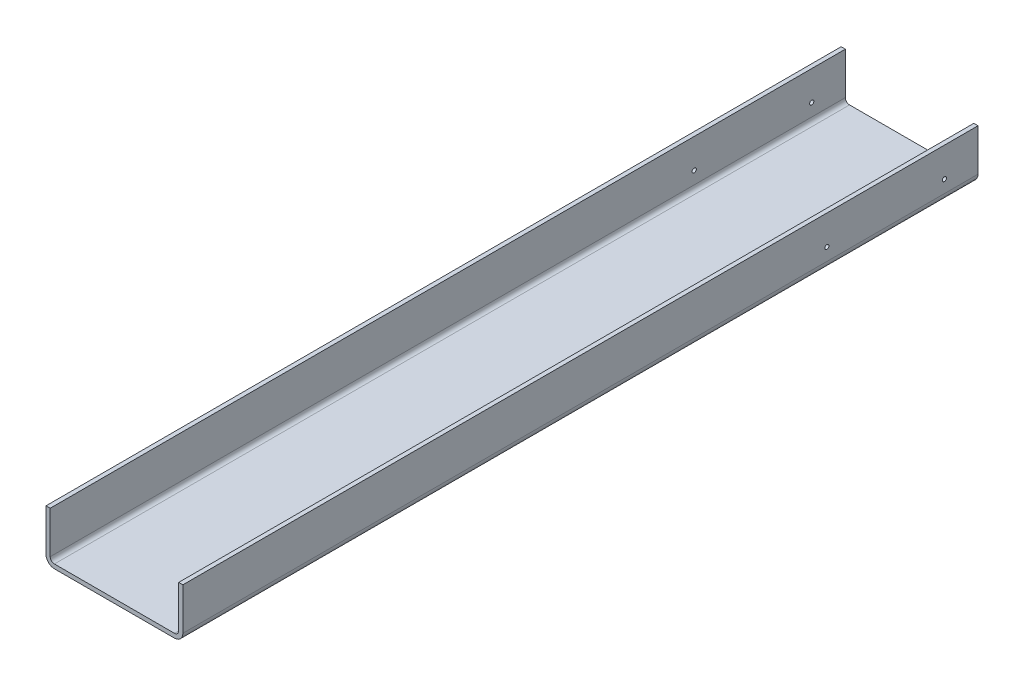
ISO-10303-21;
HEADER;
FILE_DESCRIPTION(('STEP AP214'),'2;1');
FILE_NAME('part.step','',(''),(''),'','','');
FILE_SCHEMA(('AUTOMOTIVE_DESIGN { 1 0 10303 214 1 1 1 1 }'));
ENDSEC;
DATA;
#1=APPLICATION_CONTEXT('core data for automotive mechanical design processes');
#2=APPLICATION_PROTOCOL_DEFINITION('international standard','automotive_design',2000,#1);
#3=PRODUCT_CONTEXT('',#1,'mechanical');
#4=PRODUCT('Part','Part','',(#3));
#5=PRODUCT_RELATED_PRODUCT_CATEGORY('part','',(#4));
#6=PRODUCT_DEFINITION_FORMATION('','',#4);
#7=PRODUCT_DEFINITION_CONTEXT('part definition',#1,'design');
#8=PRODUCT_DEFINITION('design','',#6,#7);
#9=PRODUCT_DEFINITION_SHAPE('','',#8);
#10=(LENGTH_UNIT() NAMED_UNIT(*) SI_UNIT(.MILLI.,.METRE.));
#11=(NAMED_UNIT(*) PLANE_ANGLE_UNIT() SI_UNIT($,.RADIAN.));
#12=(NAMED_UNIT(*) SI_UNIT($,.STERADIAN.) SOLID_ANGLE_UNIT());
#13=UNCERTAINTY_MEASURE_WITH_UNIT(LENGTH_MEASURE(1.E-05),#10,'distance_accuracy_value','');
#14=(GEOMETRIC_REPRESENTATION_CONTEXT(3) GLOBAL_UNCERTAINTY_ASSIGNED_CONTEXT((#13)) GLOBAL_UNIT_ASSIGNED_CONTEXT((#10,
#11,#12)) REPRESENTATION_CONTEXT('',''));
#15=CARTESIAN_POINT('',(0.,0.,0.));
#16=DIRECTION('',(0.,0.,1.));
#17=DIRECTION('',(1.,0.,0.));
#18=AXIS2_PLACEMENT_3D('',#15,#16,#17);
#19=CARTESIAN_POINT('',(76.5,60.,473.5));
#20=DIRECTION('',(0.,-1.,0.));
#21=DIRECTION('',(0.,0.,-1.));
#22=AXIS2_PLACEMENT_3D('',#19,#20,#21);
#23=PLANE('',#22);
#24=DIRECTION('',(-1.,0.,0.));
#25=VECTOR('',#24,1.);
#26=CARTESIAN_POINT('',(76.5,60.,-473.5));
#27=LINE('',#26,#25);
#28=CARTESIAN_POINT('',(81.5,60.,-473.5));
#29=VERTEX_POINT('',#28);
#30=CARTESIAN_POINT('',(76.5,60.,-473.5));
#31=VERTEX_POINT('',#30);
#32=EDGE_CURVE('E165',#29,#31,#27,.T.);
#33=ORIENTED_EDGE('',*,*,#32,.T.);
#34=DIRECTION('',(0.,0.,-1.));
#35=VECTOR('',#34,1.);
#36=CARTESIAN_POINT('',(76.5,60.,473.5));
#37=LINE('',#36,#35);
#38=CARTESIAN_POINT('',(76.5,60.,473.5));
#39=VERTEX_POINT('',#38);
#40=EDGE_CURVE('E11',#39,#31,#37,.T.);
#41=ORIENTED_EDGE('',*,*,#40,.F.);
#42=DIRECTION('',(-1.,0.,0.));
#43=VECTOR('',#42,1.);
#44=CARTESIAN_POINT('',(76.5,60.,473.5));
#45=LINE('',#44,#43);
#46=CARTESIAN_POINT('',(81.5,60.,473.5));
#47=VERTEX_POINT('',#46);
#48=EDGE_CURVE('E188',#47,#39,#45,.T.);
#49=ORIENTED_EDGE('',*,*,#48,.F.);
#50=DIRECTION('',(0.,0.,-1.));
#51=VECTOR('',#50,1.);
#52=CARTESIAN_POINT('',(81.5,60.,473.5));
#53=LINE('',#52,#51);
#54=EDGE_CURVE('E161',#47,#29,#53,.T.);
#55=ORIENTED_EDGE('',*,*,#54,.T.);
#56=EDGE_LOOP('',(#33,#41,#49,#55));
#57=FACE_BOUND('',#56,.T.);
#58=ADVANCED_FACE('F45',(#57),#23,.F.);
#59=CARTESIAN_POINT('',(76.5,9.99999999999998,473.5));
#60=DIRECTION('',(1.,0.,0.));
#61=DIRECTION('',(0.,0.,-1.));
#62=AXIS2_PLACEMENT_3D('',#59,#60,#61);
#63=PLANE('',#62);
#64=CARTESIAN_POINT('',(76.5,24.9114999999389,-433.5));
#65=DIRECTION('',(1.,0.,0.));
#66=DIRECTION('',(0.,0.,-1.));
#67=AXIS2_PLACEMENT_3D('',#64,#65,#66);
#68=CIRCLE('',#67,2.50000000000002);
#69=CARTESIAN_POINT('',(76.5,24.9114999999389,-436.));
#70=VERTEX_POINT('',#69);
#71=EDGE_CURVE('E169',#70,#70,#68,.T.);
#72=ORIENTED_EDGE('',*,*,#71,.T.);
#73=EDGE_LOOP('',(#72));
#74=FACE_BOUND('',#73,.T.);
#75=CARTESIAN_POINT('',(76.5,24.9114999999389,-293.5));
#76=DIRECTION('',(1.,0.,0.));
#77=DIRECTION('',(0.,0.,-1.));
#78=AXIS2_PLACEMENT_3D('',#75,#76,#77);
#79=CIRCLE('',#78,2.49999999999991);
#80=CARTESIAN_POINT('',(76.5,24.9114999999389,-296.));
#81=VERTEX_POINT('',#80);
#82=EDGE_CURVE('E445',#81,#81,#79,.T.);
#83=ORIENTED_EDGE('',*,*,#82,.T.);
#84=EDGE_LOOP('',(#83));
#85=FACE_BOUND('',#84,.T.);
#86=DIRECTION('',(0.,-1.,0.));
#87=VECTOR('',#86,1.);
#88=CARTESIAN_POINT('',(76.5,9.99999999999998,-473.5));
#89=LINE('',#88,#87);
#90=CARTESIAN_POINT('',(76.5,9.99999999999998,-473.5));
#91=VERTEX_POINT('',#90);
#92=EDGE_CURVE('E168',#31,#91,#89,.T.);
#93=ORIENTED_EDGE('',*,*,#92,.T.);
#94=DIRECTION('',(0.,0.,-1.));
#95=VECTOR('',#94,1.);
#96=CARTESIAN_POINT('',(76.5,9.99999999999998,473.5));
#97=LINE('',#96,#95);
#98=CARTESIAN_POINT('',(76.5,9.99999999999998,473.5));
#99=VERTEX_POINT('',#98);
#100=EDGE_CURVE('E53',#99,#91,#97,.T.);
#101=ORIENTED_EDGE('',*,*,#100,.F.);
#102=DIRECTION('',(0.,-1.,0.));
#103=VECTOR('',#102,1.);
#104=CARTESIAN_POINT('',(76.5,9.99999999999998,473.5));
#105=LINE('',#104,#103);
#106=EDGE_CURVE('E116',#39,#99,#105,.T.);
#107=ORIENTED_EDGE('',*,*,#106,.F.);
#108=ORIENTED_EDGE('',*,*,#40,.T.);
#109=EDGE_LOOP('',(#93,#101,#107,#108));
#110=FACE_BOUND('',#109,.T.);
#111=ADVANCED_FACE('F271',(#74,#85,#110),#63,.F.);
#112=CARTESIAN_POINT('',(71.5,9.99999999999998,473.5));
#113=DIRECTION('',(0.,0.,-1.));
#114=DIRECTION('',(-1.,0.,0.));
#115=AXIS2_PLACEMENT_3D('',#112,#113,#114);
#116=CYLINDRICAL_SURFACE('',#115,5.);
#117=CARTESIAN_POINT('',(71.5,9.99999999999998,-473.5));
#118=DIRECTION('',(0.,0.,-1.));
#119=DIRECTION('',(-1.,0.,0.));
#120=AXIS2_PLACEMENT_3D('',#117,#118,#119);
#121=CIRCLE('',#120,5.);
#122=CARTESIAN_POINT('',(71.5,4.99999999999998,-473.5));
#123=VERTEX_POINT('',#122);
#124=EDGE_CURVE('E171',#91,#123,#121,.T.);
#125=ORIENTED_EDGE('',*,*,#124,.T.);
#126=DIRECTION('',(0.,0.,-1.));
#127=VECTOR('',#126,1.);
#128=CARTESIAN_POINT('',(71.5,4.99999999999998,473.5));
#129=LINE('',#128,#127);
#130=CARTESIAN_POINT('',(71.5,4.99999999999998,473.5));
#131=VERTEX_POINT('',#130);
#132=EDGE_CURVE('E207',#131,#123,#129,.T.);
#133=ORIENTED_EDGE('',*,*,#132,.F.);
#134=CARTESIAN_POINT('',(71.5,9.99999999999998,473.5));
#135=DIRECTION('',(0.,0.,-1.));
#136=DIRECTION('',(-1.,0.,0.));
#137=AXIS2_PLACEMENT_3D('',#134,#135,#136);
#138=CIRCLE('',#137,5.);
#139=EDGE_CURVE('E215',#99,#131,#138,.T.);
#140=ORIENTED_EDGE('',*,*,#139,.F.);
#141=ORIENTED_EDGE('',*,*,#100,.T.);
#142=EDGE_LOOP('',(#125,#133,#140,#141));
#143=FACE_BOUND('',#142,.T.);
#144=ADVANCED_FACE('F213',(#143),#116,.F.);
#145=CARTESIAN_POINT('',(71.5,4.99999999999998,473.5));
#146=DIRECTION('',(0.,-1.,0.));
#147=DIRECTION('',(0.,0.,-1.));
#148=AXIS2_PLACEMENT_3D('',#145,#146,#147);
#149=PLANE('',#148);
#150=DIRECTION('',(-1.,0.,0.));
#151=VECTOR('',#150,1.);
#152=CARTESIAN_POINT('',(71.5,4.99999999999998,-473.5));
#153=LINE('',#152,#151);
#154=CARTESIAN_POINT('',(-71.5,4.99999999999998,-473.5));
#155=VERTEX_POINT('',#154);
#156=EDGE_CURVE('E173',#123,#155,#153,.T.);
#157=ORIENTED_EDGE('',*,*,#156,.T.);
#158=DIRECTION('',(0.,0.,-1.));
#159=VECTOR('',#158,1.);
#160=CARTESIAN_POINT('',(-71.5,4.99999999999998,473.5));
#161=LINE('',#160,#159);
#162=CARTESIAN_POINT('',(-71.5,4.99999999999998,473.5));
#163=VERTEX_POINT('',#162);
#164=EDGE_CURVE('E204',#163,#155,#161,.T.);
#165=ORIENTED_EDGE('',*,*,#164,.F.);
#166=DIRECTION('',(-1.,0.,0.));
#167=VECTOR('',#166,1.);
#168=CARTESIAN_POINT('',(71.5,4.99999999999998,473.5));
#169=LINE('',#168,#167);
#170=EDGE_CURVE('E233',#131,#163,#169,.T.);
#171=ORIENTED_EDGE('',*,*,#170,.F.);
#172=ORIENTED_EDGE('',*,*,#132,.T.);
#173=EDGE_LOOP('',(#157,#165,#171,#172));
#174=FACE_BOUND('',#173,.T.);
#175=ADVANCED_FACE('F224',(#174),#149,.F.);
#176=CARTESIAN_POINT('',(-71.5,9.99999999999998,473.5));
#177=DIRECTION('',(0.,0.,-1.));
#178=DIRECTION('',(-1.,0.,0.));
#179=AXIS2_PLACEMENT_3D('',#176,#177,#178);
#180=CYLINDRICAL_SURFACE('',#179,5.);
#181=CARTESIAN_POINT('',(-71.5,9.99999999999998,-473.5));
#182=DIRECTION('',(0.,0.,-1.));
#183=DIRECTION('',(-1.,0.,0.));
#184=AXIS2_PLACEMENT_3D('',#181,#182,#183);
#185=CIRCLE('',#184,5.);
#186=CARTESIAN_POINT('',(-76.5,9.99999999999998,-473.5));
#187=VERTEX_POINT('',#186);
#188=EDGE_CURVE('E175',#155,#187,#185,.T.);
#189=ORIENTED_EDGE('',*,*,#188,.T.);
#190=DIRECTION('',(0.,0.,-1.));
#191=VECTOR('',#190,1.);
#192=CARTESIAN_POINT('',(-76.5,9.99999999999998,473.5));
#193=LINE('',#192,#191);
#194=CARTESIAN_POINT('',(-76.5,9.99999999999998,473.5));
#195=VERTEX_POINT('',#194);
#196=EDGE_CURVE('E201',#195,#187,#193,.T.);
#197=ORIENTED_EDGE('',*,*,#196,.F.);
#198=CARTESIAN_POINT('',(-71.5,9.99999999999998,473.5));
#199=DIRECTION('',(0.,0.,-1.));
#200=DIRECTION('',(-1.,0.,0.));
#201=AXIS2_PLACEMENT_3D('',#198,#199,#200);
#202=CIRCLE('',#201,5.);
#203=EDGE_CURVE('E230',#163,#195,#202,.T.);
#204=ORIENTED_EDGE('',*,*,#203,.F.);
#205=ORIENTED_EDGE('',*,*,#164,.T.);
#206=EDGE_LOOP('',(#189,#197,#204,#205));
#207=FACE_BOUND('',#206,.T.);
#208=ADVANCED_FACE('F228',(#207),#180,.F.);
#209=CARTESIAN_POINT('',(-76.5,9.99999999999998,473.5));
#210=DIRECTION('',(-1.,0.,0.));
#211=DIRECTION('',(0.,0.,1.));
#212=AXIS2_PLACEMENT_3D('',#209,#210,#211);
#213=PLANE('',#212);
#214=CARTESIAN_POINT('',(-76.5,24.9114999999389,-433.5));
#215=DIRECTION('',(-1.,0.,0.));
#216=DIRECTION('',(0.,0.,1.));
#217=AXIS2_PLACEMENT_3D('',#214,#215,#216);
#218=CIRCLE('',#217,2.50000000000002);
#219=CARTESIAN_POINT('',(-76.5,24.9114999999389,-431.));
#220=VERTEX_POINT('',#219);
#221=EDGE_CURVE('E450',#220,#220,#218,.T.);
#222=ORIENTED_EDGE('',*,*,#221,.T.);
#223=EDGE_LOOP('',(#222));
#224=FACE_BOUND('',#223,.T.);
#225=CARTESIAN_POINT('',(-76.5,24.9114999999389,-293.5));
#226=DIRECTION('',(-1.,0.,0.));
#227=DIRECTION('',(0.,0.,1.));
#228=AXIS2_PLACEMENT_3D('',#225,#226,#227);
#229=CIRCLE('',#228,2.49999999999991);
#230=CARTESIAN_POINT('',(-76.5,24.9114999999389,-291.));
#231=VERTEX_POINT('',#230);
#232=EDGE_CURVE('E447',#231,#231,#229,.T.);
#233=ORIENTED_EDGE('',*,*,#232,.T.);
#234=EDGE_LOOP('',(#233));
#235=FACE_BOUND('',#234,.T.);
#236=DIRECTION('',(0.,1.,0.));
#237=VECTOR('',#236,1.);
#238=CARTESIAN_POINT('',(-76.5,9.99999999999998,-473.5));
#239=LINE('',#238,#237);
#240=CARTESIAN_POINT('',(-76.5,60.,-473.5));
#241=VERTEX_POINT('',#240);
#242=EDGE_CURVE('E177',#187,#241,#239,.T.);
#243=ORIENTED_EDGE('',*,*,#242,.T.);
#244=DIRECTION('',(0.,0.,-1.));
#245=VECTOR('',#244,1.);
#246=CARTESIAN_POINT('',(-76.5,60.,473.5));
#247=LINE('',#246,#245);
#248=CARTESIAN_POINT('',(-76.5,60.,473.5));
#249=VERTEX_POINT('',#248);
#250=EDGE_CURVE('E198',#249,#241,#247,.T.);
#251=ORIENTED_EDGE('',*,*,#250,.F.);
#252=DIRECTION('',(0.,1.,0.));
#253=VECTOR('',#252,1.);
#254=CARTESIAN_POINT('',(-76.5,9.99999999999998,473.5));
#255=LINE('',#254,#253);
#256=EDGE_CURVE('E232',#195,#249,#255,.T.);
#257=ORIENTED_EDGE('',*,*,#256,.F.);
#258=ORIENTED_EDGE('',*,*,#196,.T.);
#259=EDGE_LOOP('',(#243,#251,#257,#258));
#260=FACE_BOUND('',#259,.T.);
#261=ADVANCED_FACE('F288',(#224,#235,#260),#213,.F.);
#262=CARTESIAN_POINT('',(-81.5,60.,473.5));
#263=DIRECTION('',(0.,-1.,0.));
#264=DIRECTION('',(0.,0.,-1.));
#265=AXIS2_PLACEMENT_3D('',#262,#263,#264);
#266=PLANE('',#265);
#267=DIRECTION('',(-1.,0.,0.));
#268=VECTOR('',#267,1.);
#269=CARTESIAN_POINT('',(-81.5,60.,-473.5));
#270=LINE('',#269,#268);
#271=CARTESIAN_POINT('',(-81.5,60.,-473.5));
#272=VERTEX_POINT('',#271);
#273=EDGE_CURVE('E179',#241,#272,#270,.T.);
#274=ORIENTED_EDGE('',*,*,#273,.T.);
#275=DIRECTION('',(0.,0.,-1.));
#276=VECTOR('',#275,1.);
#277=CARTESIAN_POINT('',(-81.5,60.,473.5));
#278=LINE('',#277,#276);
#279=CARTESIAN_POINT('',(-81.5,60.,473.5));
#280=VERTEX_POINT('',#279);
#281=EDGE_CURVE('E195',#280,#272,#278,.T.);
#282=ORIENTED_EDGE('',*,*,#281,.F.);
#283=DIRECTION('',(-1.,0.,0.));
#284=VECTOR('',#283,1.);
#285=CARTESIAN_POINT('',(-81.5,60.,473.5));
#286=LINE('',#285,#284);
#287=EDGE_CURVE('E235',#249,#280,#286,.T.);
#288=ORIENTED_EDGE('',*,*,#287,.F.);
#289=ORIENTED_EDGE('',*,*,#250,.T.);
#290=EDGE_LOOP('',(#274,#282,#288,#289));
#291=FACE_BOUND('',#290,.T.);
#292=ADVANCED_FACE('F291',(#291),#266,.F.);
#293=CARTESIAN_POINT('',(-81.5,9.99999999999998,473.5));
#294=DIRECTION('',(1.,0.,0.));
#295=DIRECTION('',(0.,0.,-1.));
#296=AXIS2_PLACEMENT_3D('',#293,#294,#295);
#297=PLANE('',#296);
#298=CARTESIAN_POINT('',(-81.5,24.9114999999389,-433.5));
#299=DIRECTION('',(1.,0.,0.));
#300=DIRECTION('',(0.,0.,-1.));
#301=AXIS2_PLACEMENT_3D('',#298,#299,#300);
#302=CIRCLE('',#301,2.50000000000002);
#303=CARTESIAN_POINT('',(-81.5,24.9114999999389,-436.));
#304=VERTEX_POINT('',#303);
#305=EDGE_CURVE('E446',#304,#304,#302,.T.);
#306=ORIENTED_EDGE('',*,*,#305,.T.);
#307=EDGE_LOOP('',(#306));
#308=FACE_BOUND('',#307,.T.);
#309=CARTESIAN_POINT('',(-81.5,24.9114999999389,-293.5));
#310=DIRECTION('',(1.,0.,0.));
#311=DIRECTION('',(0.,0.,-1.));
#312=AXIS2_PLACEMENT_3D('',#309,#310,#311);
#313=CIRCLE('',#312,2.49999999999991);
#314=CARTESIAN_POINT('',(-81.5,24.9114999999389,-296.));
#315=VERTEX_POINT('',#314);
#316=EDGE_CURVE('E453',#315,#315,#313,.T.);
#317=ORIENTED_EDGE('',*,*,#316,.T.);
#318=EDGE_LOOP('',(#317));
#319=FACE_BOUND('',#318,.T.);
#320=DIRECTION('',(0.,-1.,0.));
#321=VECTOR('',#320,1.);
#322=CARTESIAN_POINT('',(-81.5,9.99999999999998,-473.5));
#323=LINE('',#322,#321);
#324=CARTESIAN_POINT('',(-81.5,9.99999999999998,-473.5));
#325=VERTEX_POINT('',#324);
#326=EDGE_CURVE('E181',#272,#325,#323,.T.);
#327=ORIENTED_EDGE('',*,*,#326,.T.);
#328=DIRECTION('',(0.,0.,-1.));
#329=VECTOR('',#328,1.);
#330=CARTESIAN_POINT('',(-81.5,9.99999999999998,473.5));
#331=LINE('',#330,#329);
#332=CARTESIAN_POINT('',(-81.5,9.99999999999998,473.5));
#333=VERTEX_POINT('',#332);
#334=EDGE_CURVE('E192',#333,#325,#331,.T.);
#335=ORIENTED_EDGE('',*,*,#334,.F.);
#336=DIRECTION('',(0.,-1.,0.));
#337=VECTOR('',#336,1.);
#338=CARTESIAN_POINT('',(-81.5,9.99999999999998,473.5));
#339=LINE('',#338,#337);
#340=EDGE_CURVE('E241',#280,#333,#339,.T.);
#341=ORIENTED_EDGE('',*,*,#340,.F.);
#342=ORIENTED_EDGE('',*,*,#281,.T.);
#343=EDGE_LOOP('',(#327,#335,#341,#342));
#344=FACE_BOUND('',#343,.T.);
#345=ADVANCED_FACE('F247',(#308,#319,#344),#297,.F.);
#346=CARTESIAN_POINT('',(-71.5,9.99999999999998,473.5));
#347=DIRECTION('',(0.,0.,-1.));
#348=DIRECTION('',(-1.,0.,0.));
#349=AXIS2_PLACEMENT_3D('',#346,#347,#348);
#350=CYLINDRICAL_SURFACE('',#349,9.99999999999999);
#351=CARTESIAN_POINT('',(-71.5,9.99999999999998,-473.5));
#352=DIRECTION('',(0.,0.,1.));
#353=DIRECTION('',(-1.,0.,0.));
#354=AXIS2_PLACEMENT_3D('',#351,#352,#353);
#355=CIRCLE('',#354,9.99999999999999);
#356=CARTESIAN_POINT('',(-71.5,0.,-473.5));
#357=VERTEX_POINT('',#356);
#358=EDGE_CURVE('E183',#325,#357,#355,.T.);
#359=ORIENTED_EDGE('',*,*,#358,.T.);
#360=DIRECTION('',(0.,0.,-1.));
#361=VECTOR('',#360,1.);
#362=CARTESIAN_POINT('',(-71.5,0.,473.5));
#363=LINE('',#362,#361);
#364=CARTESIAN_POINT('',(-71.5,0.,473.5));
#365=VERTEX_POINT('',#364);
#366=EDGE_CURVE('E156',#365,#357,#363,.T.);
#367=ORIENTED_EDGE('',*,*,#366,.F.);
#368=CARTESIAN_POINT('',(-71.5,9.99999999999998,473.5));
#369=DIRECTION('',(0.,0.,1.));
#370=DIRECTION('',(-1.,0.,0.));
#371=AXIS2_PLACEMENT_3D('',#368,#369,#370);
#372=CIRCLE('',#371,9.99999999999999);
#373=EDGE_CURVE('E147',#333,#365,#372,.T.);
#374=ORIENTED_EDGE('',*,*,#373,.F.);
#375=ORIENTED_EDGE('',*,*,#334,.T.);
#376=EDGE_LOOP('',(#359,#367,#374,#375));
#377=FACE_BOUND('',#376,.T.);
#378=ADVANCED_FACE('F251',(#377),#350,.T.);
#379=CARTESIAN_POINT('',(71.5,0.,473.5));
#380=DIRECTION('',(0.,1.,0.));
#381=DIRECTION('',(0.,0.,1.));
#382=AXIS2_PLACEMENT_3D('',#379,#380,#381);
#383=PLANE('',#382);
#384=DIRECTION('',(1.,0.,0.));
#385=VECTOR('',#384,1.);
#386=CARTESIAN_POINT('',(71.5,0.,-473.5));
#387=LINE('',#386,#385);
#388=CARTESIAN_POINT('',(71.5,0.,-473.5));
#389=VERTEX_POINT('',#388);
#390=EDGE_CURVE('E155',#357,#389,#387,.T.);
#391=ORIENTED_EDGE('',*,*,#390,.T.);
#392=DIRECTION('',(0.,0.,-1.));
#393=VECTOR('',#392,1.);
#394=CARTESIAN_POINT('',(71.5,0.,473.5));
#395=LINE('',#394,#393);
#396=CARTESIAN_POINT('',(71.5,0.,473.5));
#397=VERTEX_POINT('',#396);
#398=EDGE_CURVE('E152',#397,#389,#395,.T.);
#399=ORIENTED_EDGE('',*,*,#398,.F.);
#400=DIRECTION('',(1.,0.,0.));
#401=VECTOR('',#400,1.);
#402=CARTESIAN_POINT('',(71.5,0.,473.5));
#403=LINE('',#402,#401);
#404=EDGE_CURVE('E141',#365,#397,#403,.T.);
#405=ORIENTED_EDGE('',*,*,#404,.F.);
#406=ORIENTED_EDGE('',*,*,#366,.T.);
#407=EDGE_LOOP('',(#391,#399,#405,#406));
#408=FACE_BOUND('',#407,.T.);
#409=ADVANCED_FACE('F153',(#408),#383,.F.);
#410=CARTESIAN_POINT('',(71.5,9.99999999999998,473.5));
#411=DIRECTION('',(0.,0.,-1.));
#412=DIRECTION('',(-1.,0.,0.));
#413=AXIS2_PLACEMENT_3D('',#410,#411,#412);
#414=CYLINDRICAL_SURFACE('',#413,9.99999999999999);
#415=CARTESIAN_POINT('',(71.5,9.99999999999998,-473.5));
#416=DIRECTION('',(0.,0.,1.));
#417=DIRECTION('',(-1.,0.,0.));
#418=AXIS2_PLACEMENT_3D('',#415,#416,#417);
#419=CIRCLE('',#418,9.99999999999999);
#420=CARTESIAN_POINT('',(81.5,9.99999999999998,-473.5));
#421=VERTEX_POINT('',#420);
#422=EDGE_CURVE('E102',#389,#421,#419,.T.);
#423=ORIENTED_EDGE('',*,*,#422,.T.);
#424=DIRECTION('',(0.,0.,-1.));
#425=VECTOR('',#424,1.);
#426=CARTESIAN_POINT('',(81.5,9.99999999999998,473.5));
#427=LINE('',#426,#425);
#428=CARTESIAN_POINT('',(81.5,9.99999999999998,473.5));
#429=VERTEX_POINT('',#428);
#430=EDGE_CURVE('E157',#429,#421,#427,.T.);
#431=ORIENTED_EDGE('',*,*,#430,.F.);
#432=CARTESIAN_POINT('',(71.5,9.99999999999998,473.5));
#433=DIRECTION('',(0.,0.,1.));
#434=DIRECTION('',(-1.,0.,0.));
#435=AXIS2_PLACEMENT_3D('',#432,#433,#434);
#436=CIRCLE('',#435,9.99999999999999);
#437=EDGE_CURVE('E145',#397,#429,#436,.T.);
#438=ORIENTED_EDGE('',*,*,#437,.F.);
#439=ORIENTED_EDGE('',*,*,#398,.T.);
#440=EDGE_LOOP('',(#423,#431,#438,#439));
#441=FACE_BOUND('',#440,.T.);
#442=ADVANCED_FACE('F159',(#441),#414,.T.);
#443=CARTESIAN_POINT('',(81.5,9.99999999999998,473.5));
#444=DIRECTION('',(-1.,0.,0.));
#445=DIRECTION('',(0.,0.,1.));
#446=AXIS2_PLACEMENT_3D('',#443,#444,#445);
#447=PLANE('',#446);
#448=CARTESIAN_POINT('',(81.5,24.9114999999389,-433.5));
#449=DIRECTION('',(-1.,0.,0.));
#450=DIRECTION('',(0.,0.,1.));
#451=AXIS2_PLACEMENT_3D('',#448,#449,#450);
#452=CIRCLE('',#451,2.50000000000002);
#453=CARTESIAN_POINT('',(81.5,24.9114999999389,-431.));
#454=VERTEX_POINT('',#453);
#455=EDGE_CURVE('E473',#454,#454,#452,.T.);
#456=ORIENTED_EDGE('',*,*,#455,.T.);
#457=EDGE_LOOP('',(#456));
#458=FACE_BOUND('',#457,.T.);
#459=CARTESIAN_POINT('',(81.5,24.9114999999389,-293.5));
#460=DIRECTION('',(-1.,0.,0.));
#461=DIRECTION('',(0.,0.,1.));
#462=AXIS2_PLACEMENT_3D('',#459,#460,#461);
#463=CIRCLE('',#462,2.49999999999991);
#464=CARTESIAN_POINT('',(81.5,24.9114999999389,-291.));
#465=VERTEX_POINT('',#464);
#466=EDGE_CURVE('E442',#465,#465,#463,.T.);
#467=ORIENTED_EDGE('',*,*,#466,.T.);
#468=EDGE_LOOP('',(#467));
#469=FACE_BOUND('',#468,.T.);
#470=DIRECTION('',(0.,1.,0.));
#471=VECTOR('',#470,1.);
#472=CARTESIAN_POINT('',(81.5,9.99999999999998,-473.5));
#473=LINE('',#472,#471);
#474=EDGE_CURVE('E108',#421,#29,#473,.T.);
#475=ORIENTED_EDGE('',*,*,#474,.T.);
#476=ORIENTED_EDGE('',*,*,#54,.F.);
#477=DIRECTION('',(0.,1.,0.));
#478=VECTOR('',#477,1.);
#479=CARTESIAN_POINT('',(81.5,9.99999999999998,473.5));
#480=LINE('',#479,#478);
#481=EDGE_CURVE('E61',#429,#47,#480,.T.);
#482=ORIENTED_EDGE('',*,*,#481,.F.);
#483=ORIENTED_EDGE('',*,*,#430,.T.);
#484=EDGE_LOOP('',(#475,#476,#482,#483));
#485=FACE_BOUND('',#484,.T.);
#486=ADVANCED_FACE('F255',(#458,#469,#485),#447,.F.);
#487=CARTESIAN_POINT('',(71.5,9.99999999999998,473.5));
#488=DIRECTION('',(0.,0.,-1.));
#489=DIRECTION('',(-1.,0.,0.));
#490=AXIS2_PLACEMENT_3D('',#487,#488,#489);
#491=PLANE('',#490);
#492=ORIENTED_EDGE('',*,*,#48,.T.);
#493=ORIENTED_EDGE('',*,*,#106,.T.);
#494=ORIENTED_EDGE('',*,*,#139,.T.);
#495=ORIENTED_EDGE('',*,*,#170,.T.);
#496=ORIENTED_EDGE('',*,*,#203,.T.);
#497=ORIENTED_EDGE('',*,*,#256,.T.);
#498=ORIENTED_EDGE('',*,*,#287,.T.);
#499=ORIENTED_EDGE('',*,*,#340,.T.);
#500=ORIENTED_EDGE('',*,*,#373,.T.);
#501=ORIENTED_EDGE('',*,*,#404,.T.);
#502=ORIENTED_EDGE('',*,*,#437,.T.);
#503=ORIENTED_EDGE('',*,*,#481,.T.);
#504=EDGE_LOOP('',(#492,#493,#494,#495,#496,#497,#498,#499,#500,#501,#502,#503));
#505=FACE_BOUND('',#504,.T.);
#506=ADVANCED_FACE('F143',(#505),#491,.F.);
#507=CARTESIAN_POINT('',(71.5,9.99999999999998,-473.5));
#508=DIRECTION('',(0.,0.,-1.));
#509=DIRECTION('',(-1.,0.,0.));
#510=AXIS2_PLACEMENT_3D('',#507,#508,#509);
#511=PLANE('',#510);
#512=ORIENTED_EDGE('',*,*,#32,.F.);
#513=ORIENTED_EDGE('',*,*,#474,.F.);
#514=ORIENTED_EDGE('',*,*,#422,.F.);
#515=ORIENTED_EDGE('',*,*,#390,.F.);
#516=ORIENTED_EDGE('',*,*,#358,.F.);
#517=ORIENTED_EDGE('',*,*,#326,.F.);
#518=ORIENTED_EDGE('',*,*,#273,.F.);
#519=ORIENTED_EDGE('',*,*,#242,.F.);
#520=ORIENTED_EDGE('',*,*,#188,.F.);
#521=ORIENTED_EDGE('',*,*,#156,.F.);
#522=ORIENTED_EDGE('',*,*,#124,.F.);
#523=ORIENTED_EDGE('',*,*,#92,.F.);
#524=EDGE_LOOP('',(#512,#513,#514,#515,#516,#517,#518,#519,#520,#521,#522,#523));
#525=FACE_BOUND('',#524,.T.);
#526=ADVANCED_FACE('F219',(#525),#511,.T.);
#527=CARTESIAN_POINT('',(81.5,24.9114999999389,-293.5));
#528=DIRECTION('',(-1.,0.,0.));
#529=DIRECTION('',(0.,0.,1.));
#530=AXIS2_PLACEMENT_3D('',#527,#528,#529);
#531=CYLINDRICAL_SURFACE('',#530,2.49999999999991);
#532=ORIENTED_EDGE('',*,*,#466,.F.);
#533=EDGE_LOOP('',(#532));
#534=FACE_BOUND('',#533,.T.);
#535=ORIENTED_EDGE('',*,*,#82,.F.);
#536=EDGE_LOOP('',(#535));
#537=FACE_BOUND('',#536,.T.);
#538=ADVANCED_FACE('F323',(#534,#537),#531,.F.);
#539=CARTESIAN_POINT('',(81.5,24.9114999999389,-433.5));
#540=DIRECTION('',(-1.,0.,0.));
#541=DIRECTION('',(0.,0.,1.));
#542=AXIS2_PLACEMENT_3D('',#539,#540,#541);
#543=CYLINDRICAL_SURFACE('',#542,2.50000000000002);
#544=ORIENTED_EDGE('',*,*,#455,.F.);
#545=EDGE_LOOP('',(#544));
#546=FACE_BOUND('',#545,.T.);
#547=ORIENTED_EDGE('',*,*,#71,.F.);
#548=EDGE_LOOP('',(#547));
#549=FACE_BOUND('',#548,.T.);
#550=ADVANCED_FACE('F361',(#546,#549),#543,.F.);
#551=ORIENTED_EDGE('',*,*,#316,.F.);
#552=EDGE_LOOP('',(#551));
#553=FACE_BOUND('',#552,.T.);
#554=ORIENTED_EDGE('',*,*,#232,.F.);
#555=EDGE_LOOP('',(#554));
#556=FACE_BOUND('',#555,.T.);
#557=ADVANCED_FACE('F353',(#553,#556),#531,.F.);
#558=ORIENTED_EDGE('',*,*,#305,.F.);
#559=EDGE_LOOP('',(#558));
#560=FACE_BOUND('',#559,.T.);
#561=ORIENTED_EDGE('',*,*,#221,.F.);
#562=EDGE_LOOP('',(#561));
#563=FACE_BOUND('',#562,.T.);
#564=ADVANCED_FACE('F356',(#560,#563),#543,.F.);
#565=CLOSED_SHELL('',(#58,#111,#144,#175,#208,#261,#292,#345,#378,#409,#442,#486,#506,#526,#538,
#550,#557,#564));
#566=MANIFOLD_SOLID_BREP('B2',#565);
#567=ADVANCED_BREP_SHAPE_REPRESENTATION('',(#18,#566),#14);
#568=SHAPE_DEFINITION_REPRESENTATION(#9,#567);
ENDSEC;
END-ISO-10303-21;
